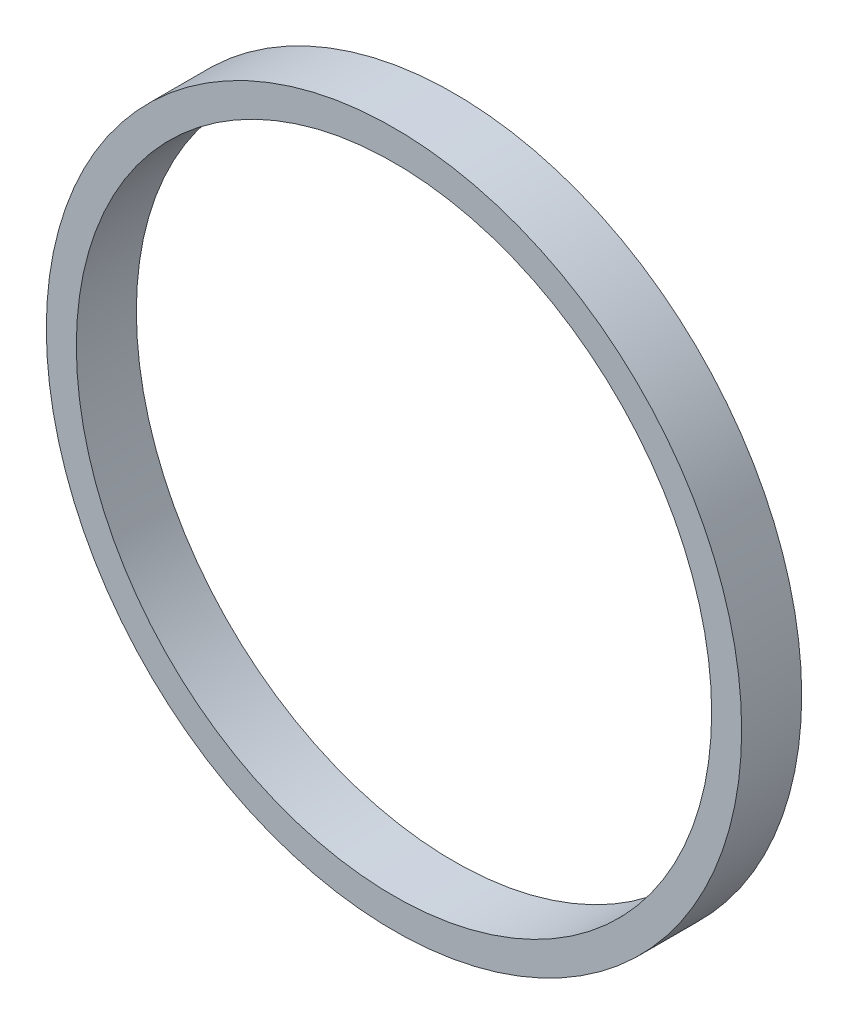
ISO-10303-21;
HEADER;
FILE_DESCRIPTION(('STEP AP214'),'2;1');
FILE_NAME('part.step','',(''),(''),'','','');
FILE_SCHEMA(('AUTOMOTIVE_DESIGN { 1 0 10303 214 1 1 1 1 }'));
ENDSEC;
DATA;
#1=APPLICATION_CONTEXT('core data for automotive mechanical design processes');
#2=APPLICATION_PROTOCOL_DEFINITION('international standard','automotive_design',2000,#1);
#3=PRODUCT_CONTEXT('',#1,'mechanical');
#4=PRODUCT('Part','Part','',(#3));
#5=PRODUCT_RELATED_PRODUCT_CATEGORY('part','',(#4));
#6=PRODUCT_DEFINITION_FORMATION('','',#4);
#7=PRODUCT_DEFINITION_CONTEXT('part definition',#1,'design');
#8=PRODUCT_DEFINITION('design','',#6,#7);
#9=PRODUCT_DEFINITION_SHAPE('','',#8);
#10=(LENGTH_UNIT() NAMED_UNIT(*) SI_UNIT(.MILLI.,.METRE.));
#11=(NAMED_UNIT(*) PLANE_ANGLE_UNIT() SI_UNIT($,.RADIAN.));
#12=(NAMED_UNIT(*) SI_UNIT($,.STERADIAN.) SOLID_ANGLE_UNIT());
#13=UNCERTAINTY_MEASURE_WITH_UNIT(LENGTH_MEASURE(1.E-05),#10,'distance_accuracy_value','');
#14=(GEOMETRIC_REPRESENTATION_CONTEXT(3) GLOBAL_UNCERTAINTY_ASSIGNED_CONTEXT((#13)) GLOBAL_UNIT_ASSIGNED_CONTEXT((#10,
#11,#12)) REPRESENTATION_CONTEXT('',''));
#15=CARTESIAN_POINT('',(0.,0.,0.));
#16=DIRECTION('',(0.,0.,1.));
#17=DIRECTION('',(1.,0.,0.));
#18=AXIS2_PLACEMENT_3D('',#15,#16,#17);
#19=CARTESIAN_POINT('',(0.,0.,7.62));
#20=DIRECTION('',(0.,0.,-1.));
#21=DIRECTION('',(-1.,0.,0.));
#22=AXIS2_PLACEMENT_3D('',#19,#20,#21);
#23=CYLINDRICAL_SURFACE('',#22,44.1325);
#24=CARTESIAN_POINT('',(0.,0.,7.62));
#25=DIRECTION('',(0.,0.,1.));
#26=DIRECTION('',(1.,0.,0.));
#27=AXIS2_PLACEMENT_3D('',#24,#25,#26);
#28=CIRCLE('',#27,44.1325);
#29=CARTESIAN_POINT('',(-44.1325,0.,7.62));
#30=VERTEX_POINT('',#29);
#31=EDGE_CURVE('E10',#30,#30,#28,.T.);
#32=CARTESIAN_POINT('',(0.,0.,0.));
#33=DIRECTION('',(0.,0.,1.));
#34=DIRECTION('',(1.,0.,0.));
#35=AXIS2_PLACEMENT_3D('',#32,#33,#34);
#36=CIRCLE('',#35,44.1325);
#37=CARTESIAN_POINT('',(-44.1325,0.,0.));
#38=VERTEX_POINT('',#37);
#39=EDGE_CURVE('E34',#38,#38,#36,.T.);
#40=CARTESIAN_POINT('',(-44.1325,0.,7.62));
#41=CARTESIAN_POINT('',(-44.1325,0.,7.540625));
#42=CARTESIAN_POINT('',(-44.1325,0.,7.46125));
#43=CARTESIAN_POINT('',(-44.1325,0.,7.3025));
#44=CARTESIAN_POINT('',(-44.1325,0.,7.223125));
#45=CARTESIAN_POINT('',(-44.1325,0.,7.064375));
#46=CARTESIAN_POINT('',(-44.1325,0.,6.985));
#47=CARTESIAN_POINT('',(-44.1325,0.,6.82625));
#48=CARTESIAN_POINT('',(-44.1325,0.,6.746875));
#49=CARTESIAN_POINT('',(-44.1325,0.,6.588125));
#50=CARTESIAN_POINT('',(-44.1325,0.,6.50875));
#51=CARTESIAN_POINT('',(-44.1325,0.,6.35));
#52=CARTESIAN_POINT('',(-44.1325,0.,6.270625));
#53=CARTESIAN_POINT('',(-44.1325,0.,6.111875));
#54=CARTESIAN_POINT('',(-44.1325,0.,6.0325));
#55=CARTESIAN_POINT('',(-44.1325,0.,5.87375));
#56=CARTESIAN_POINT('',(-44.1325,0.,5.794375));
#57=CARTESIAN_POINT('',(-44.1325,0.,5.635625));
#58=CARTESIAN_POINT('',(-44.1325,0.,5.55625));
#59=CARTESIAN_POINT('',(-44.1325,0.,5.3975));
#60=CARTESIAN_POINT('',(-44.1325,0.,5.318125));
#61=CARTESIAN_POINT('',(-44.1325,0.,5.159375));
#62=CARTESIAN_POINT('',(-44.1325,0.,5.08));
#63=CARTESIAN_POINT('',(-44.1325,0.,4.92125));
#64=CARTESIAN_POINT('',(-44.1325,0.,4.841875));
#65=CARTESIAN_POINT('',(-44.1325,0.,4.683125));
#66=CARTESIAN_POINT('',(-44.1325,0.,4.60375));
#67=CARTESIAN_POINT('',(-44.1325,0.,4.445));
#68=CARTESIAN_POINT('',(-44.1325,0.,4.365625));
#69=CARTESIAN_POINT('',(-44.1325,0.,4.206875));
#70=CARTESIAN_POINT('',(-44.1325,0.,4.1275));
#71=CARTESIAN_POINT('',(-44.1325,0.,3.96875));
#72=CARTESIAN_POINT('',(-44.1325,0.,3.889375));
#73=CARTESIAN_POINT('',(-44.1325,0.,3.730625));
#74=CARTESIAN_POINT('',(-44.1325,0.,3.65125));
#75=CARTESIAN_POINT('',(-44.1325,0.,3.4925));
#76=CARTESIAN_POINT('',(-44.1325,0.,3.413125));
#77=CARTESIAN_POINT('',(-44.1325,0.,3.254375));
#78=CARTESIAN_POINT('',(-44.1325,0.,3.175));
#79=CARTESIAN_POINT('',(-44.1325,0.,3.01625));
#80=CARTESIAN_POINT('',(-44.1325,0.,2.936875));
#81=CARTESIAN_POINT('',(-44.1325,0.,2.778125));
#82=CARTESIAN_POINT('',(-44.1325,0.,2.69875));
#83=CARTESIAN_POINT('',(-44.1325,0.,2.54));
#84=CARTESIAN_POINT('',(-44.1325,0.,2.460625));
#85=CARTESIAN_POINT('',(-44.1325,0.,2.301875));
#86=CARTESIAN_POINT('',(-44.1325,0.,2.2225));
#87=CARTESIAN_POINT('',(-44.1325,0.,2.06375));
#88=CARTESIAN_POINT('',(-44.1325,0.,1.984375));
#89=CARTESIAN_POINT('',(-44.1325,0.,1.825625));
#90=CARTESIAN_POINT('',(-44.1325,0.,1.74625));
#91=CARTESIAN_POINT('',(-44.1325,0.,1.5875));
#92=CARTESIAN_POINT('',(-44.1325,0.,1.508125));
#93=CARTESIAN_POINT('',(-44.1325,0.,1.349375));
#94=CARTESIAN_POINT('',(-44.1325,0.,1.27));
#95=CARTESIAN_POINT('',(-44.1325,0.,1.11125));
#96=CARTESIAN_POINT('',(-44.1325,0.,1.031875));
#97=CARTESIAN_POINT('',(-44.1325,0.,0.873125));
#98=CARTESIAN_POINT('',(-44.1325,0.,0.79375));
#99=CARTESIAN_POINT('',(-44.1325,0.,0.635));
#100=CARTESIAN_POINT('',(-44.1325,0.,0.555625));
#101=CARTESIAN_POINT('',(-44.1325,0.,0.396875));
#102=CARTESIAN_POINT('',(-44.1325,0.,0.3175));
#103=CARTESIAN_POINT('',(-44.1325,0.,0.15875));
#104=CARTESIAN_POINT('',(-44.1325,0.,0.0793749999999999));
#105=CARTESIAN_POINT('',(-44.1325,0.,0.));
#106=B_SPLINE_CURVE_WITH_KNOTS('',3,(#40,#41,#42,#43,#44,#45,#46,#47,#48,#49,#50,#51,#52,#53,
#54,#55,#56,#57,#58,#59,#60,#61,#62,#63,#64,#65,#66,#67,#68,#69,#70,#71,#72,#73,#74,#75,#76,#77,
#78,#79,#80,#81,#82,#83,#84,#85,#86,#87,#88,#89,#90,#91,#92,#93,#94,#95,#96,#97,#98,#99,#100,
#101,#102,#103,#104,#105),.UNSPECIFIED.,.F.,.F.,(4,2,2,2,2,2,2,2,2,2,2,2,2,2,2,2,2,2,2,2,2,2,2,
2,2,2,2,2,2,2,2,2,4),(0.,0.238125,0.476249999999999,0.714375,0.952499999999999,1.190625,1.42875,
1.666875,1.905,2.143125,2.38125,2.619375,2.8575,3.095625,3.33375,3.571875,3.81,4.048125,4.28625,
4.524375,4.7625,5.000625,5.23875,5.476875,5.715,5.953125,6.19125,6.429375,6.6675,6.905625,
7.14375,7.381875,7.62),.UNSPECIFIED.);
#107=EDGE_CURVE('BSEAM31',#30,#38,#106,.T.);
#108=ORIENTED_EDGE('',*,*,#31,.F.);
#109=ORIENTED_EDGE('',*,*,#39,.T.);
#110=ORIENTED_EDGE('',*,*,#107,.T.);
#111=ORIENTED_EDGE('',*,*,#107,.F.);
#112=EDGE_LOOP('',(#108,#110,#109,#111));
#113=FACE_BOUND('',#112,.T.);
#114=ADVANCED_FACE('F31',(#113),#23,.T.);
#115=CARTESIAN_POINT('',(0.,0.,7.62));
#116=DIRECTION('',(0.,0.,1.));
#117=DIRECTION('',(1.,0.,0.));
#118=AXIS2_PLACEMENT_3D('',#115,#116,#117);
#119=PLANE('',#118);
#120=CARTESIAN_POINT('',(0.,0.,7.62));
#121=DIRECTION('',(0.,0.,-1.));
#122=DIRECTION('',(-1.,0.,0.));
#123=AXIS2_PLACEMENT_3D('',#120,#121,#122);
#124=CIRCLE('',#123,40.3225);
#125=CARTESIAN_POINT('',(-40.3225,0.,7.62));
#126=VERTEX_POINT('',#125);
#127=EDGE_CURVE('E41',#126,#126,#124,.T.);
#128=ORIENTED_EDGE('',*,*,#127,.T.);
#129=EDGE_LOOP('',(#128));
#130=FACE_BOUND('',#129,.T.);
#131=ORIENTED_EDGE('',*,*,#31,.T.);
#132=EDGE_LOOP('',(#131));
#133=FACE_BOUND('',#132,.T.);
#134=ADVANCED_FACE('F49',(#130,#133),#119,.T.);
#135=CARTESIAN_POINT('',(0.,0.,0.));
#136=DIRECTION('',(0.,0.,1.));
#137=DIRECTION('',(1.,0.,0.));
#138=AXIS2_PLACEMENT_3D('',#135,#136,#137);
#139=PLANE('',#138);
#140=CARTESIAN_POINT('',(0.,0.,0.));
#141=DIRECTION('',(0.,0.,-1.));
#142=DIRECTION('',(-1.,0.,0.));
#143=AXIS2_PLACEMENT_3D('',#140,#141,#142);
#144=CIRCLE('',#143,40.3225);
#145=CARTESIAN_POINT('',(-40.3225,0.,0.));
#146=VERTEX_POINT('',#145);
#147=EDGE_CURVE('E43',#146,#146,#144,.T.);
#148=ORIENTED_EDGE('',*,*,#147,.F.);
#149=EDGE_LOOP('',(#148));
#150=FACE_BOUND('',#149,.T.);
#151=ORIENTED_EDGE('',*,*,#39,.F.);
#152=EDGE_LOOP('',(#151));
#153=FACE_BOUND('',#152,.T.);
#154=ADVANCED_FACE('F54',(#150,#153),#139,.F.);
#155=CARTESIAN_POINT('',(0.,0.,7.62));
#156=DIRECTION('',(0.,0.,-1.));
#157=DIRECTION('',(-1.,0.,0.));
#158=AXIS2_PLACEMENT_3D('',#155,#156,#157);
#159=CYLINDRICAL_SURFACE('',#158,40.3225);
#160=CARTESIAN_POINT('',(-40.3225,0.,7.62));
#161=CARTESIAN_POINT('',(-40.3225,0.,7.540625));
#162=CARTESIAN_POINT('',(-40.3225,0.,7.46125));
#163=CARTESIAN_POINT('',(-40.3225,0.,7.3025));
#164=CARTESIAN_POINT('',(-40.3225,0.,7.223125));
#165=CARTESIAN_POINT('',(-40.3225,0.,7.064375));
#166=CARTESIAN_POINT('',(-40.3225,0.,6.985));
#167=CARTESIAN_POINT('',(-40.3225,0.,6.82625));
#168=CARTESIAN_POINT('',(-40.3225,0.,6.746875));
#169=CARTESIAN_POINT('',(-40.3225,0.,6.588125));
#170=CARTESIAN_POINT('',(-40.3225,0.,6.50875));
#171=CARTESIAN_POINT('',(-40.3225,0.,6.35));
#172=CARTESIAN_POINT('',(-40.3225,0.,6.270625));
#173=CARTESIAN_POINT('',(-40.3225,0.,6.111875));
#174=CARTESIAN_POINT('',(-40.3225,0.,6.0325));
#175=CARTESIAN_POINT('',(-40.3225,0.,5.87375));
#176=CARTESIAN_POINT('',(-40.3225,0.,5.794375));
#177=CARTESIAN_POINT('',(-40.3225,0.,5.635625));
#178=CARTESIAN_POINT('',(-40.3225,0.,5.55625));
#179=CARTESIAN_POINT('',(-40.3225,0.,5.3975));
#180=CARTESIAN_POINT('',(-40.3225,0.,5.318125));
#181=CARTESIAN_POINT('',(-40.3225,0.,5.159375));
#182=CARTESIAN_POINT('',(-40.3225,0.,5.08));
#183=CARTESIAN_POINT('',(-40.3225,0.,4.92125));
#184=CARTESIAN_POINT('',(-40.3225,0.,4.841875));
#185=CARTESIAN_POINT('',(-40.3225,0.,4.683125));
#186=CARTESIAN_POINT('',(-40.3225,0.,4.60375));
#187=CARTESIAN_POINT('',(-40.3225,0.,4.445));
#188=CARTESIAN_POINT('',(-40.3225,0.,4.365625));
#189=CARTESIAN_POINT('',(-40.3225,0.,4.206875));
#190=CARTESIAN_POINT('',(-40.3225,0.,4.1275));
#191=CARTESIAN_POINT('',(-40.3225,0.,3.96875));
#192=CARTESIAN_POINT('',(-40.3225,0.,3.889375));
#193=CARTESIAN_POINT('',(-40.3225,0.,3.730625));
#194=CARTESIAN_POINT('',(-40.3225,0.,3.65125));
#195=CARTESIAN_POINT('',(-40.3225,0.,3.4925));
#196=CARTESIAN_POINT('',(-40.3225,0.,3.413125));
#197=CARTESIAN_POINT('',(-40.3225,0.,3.254375));
#198=CARTESIAN_POINT('',(-40.3225,0.,3.175));
#199=CARTESIAN_POINT('',(-40.3225,0.,3.01625));
#200=CARTESIAN_POINT('',(-40.3225,0.,2.936875));
#201=CARTESIAN_POINT('',(-40.3225,0.,2.778125));
#202=CARTESIAN_POINT('',(-40.3225,0.,2.69875));
#203=CARTESIAN_POINT('',(-40.3225,0.,2.54));
#204=CARTESIAN_POINT('',(-40.3225,0.,2.460625));
#205=CARTESIAN_POINT('',(-40.3225,0.,2.301875));
#206=CARTESIAN_POINT('',(-40.3225,0.,2.2225));
#207=CARTESIAN_POINT('',(-40.3225,0.,2.06375));
#208=CARTESIAN_POINT('',(-40.3225,0.,1.984375));
#209=CARTESIAN_POINT('',(-40.3225,0.,1.825625));
#210=CARTESIAN_POINT('',(-40.3225,0.,1.74625));
#211=CARTESIAN_POINT('',(-40.3225,0.,1.5875));
#212=CARTESIAN_POINT('',(-40.3225,0.,1.508125));
#213=CARTESIAN_POINT('',(-40.3225,0.,1.349375));
#214=CARTESIAN_POINT('',(-40.3225,0.,1.27));
#215=CARTESIAN_POINT('',(-40.3225,0.,1.11125));
#216=CARTESIAN_POINT('',(-40.3225,0.,1.031875));
#217=CARTESIAN_POINT('',(-40.3225,0.,0.873125));
#218=CARTESIAN_POINT('',(-40.3225,0.,0.79375));
#219=CARTESIAN_POINT('',(-40.3225,0.,0.635));
#220=CARTESIAN_POINT('',(-40.3225,0.,0.555625));
#221=CARTESIAN_POINT('',(-40.3225,0.,0.396875));
#222=CARTESIAN_POINT('',(-40.3225,0.,0.3175));
#223=CARTESIAN_POINT('',(-40.3225,0.,0.15875));
#224=CARTESIAN_POINT('',(-40.3225,0.,0.0793749999999999));
#225=CARTESIAN_POINT('',(-40.3225,0.,0.));
#226=B_SPLINE_CURVE_WITH_KNOTS('',3,(#160,#161,#162,#163,#164,#165,#166,#167,#168,#169,#170,
#171,#172,#173,#174,#175,#176,#177,#178,#179,#180,#181,#182,#183,#184,#185,#186,#187,#188,#189,
#190,#191,#192,#193,#194,#195,#196,#197,#198,#199,#200,#201,#202,#203,#204,#205,#206,#207,#208,
#209,#210,#211,#212,#213,#214,#215,#216,#217,#218,#219,#220,#221,#222,#223,#224,#225),
.UNSPECIFIED.,.F.,.F.,(4,2,2,2,2,2,2,2,2,2,2,2,2,2,2,2,2,2,2,2,2,2,2,2,2,2,2,2,2,2,2,2,4),(0.,
0.238125,0.47625,0.714375000000001,0.9525,1.190625,1.42875,1.666875,1.905,2.143125,2.38125,
2.619375,2.8575,3.095625,3.33375,3.571875,3.81,4.048125,4.28625,4.524375,4.7625,5.000625,
5.23875,5.476875,5.715,5.953125,6.19125,6.429375,6.6675,6.905625,7.14375,7.381875,7.62),.UNSPECIFIED.);
#227=EDGE_CURVE('BSEAM51',#126,#146,#226,.T.);
#228=ORIENTED_EDGE('',*,*,#127,.F.);
#229=ORIENTED_EDGE('',*,*,#147,.T.);
#230=ORIENTED_EDGE('',*,*,#227,.T.);
#231=ORIENTED_EDGE('',*,*,#227,.F.);
#232=EDGE_LOOP('',(#228,#230,#229,#231));
#233=FACE_BOUND('',#232,.T.);
#234=ADVANCED_FACE('F51',(#233),#159,.F.);
#235=CLOSED_SHELL('',(#114,#134,#154,#234));
#236=MANIFOLD_SOLID_BREP('B2',#235);
#237=ADVANCED_BREP_SHAPE_REPRESENTATION('',(#18,#236),#14);
#238=SHAPE_DEFINITION_REPRESENTATION(#9,#237);
ENDSEC;
END-ISO-10303-21;
